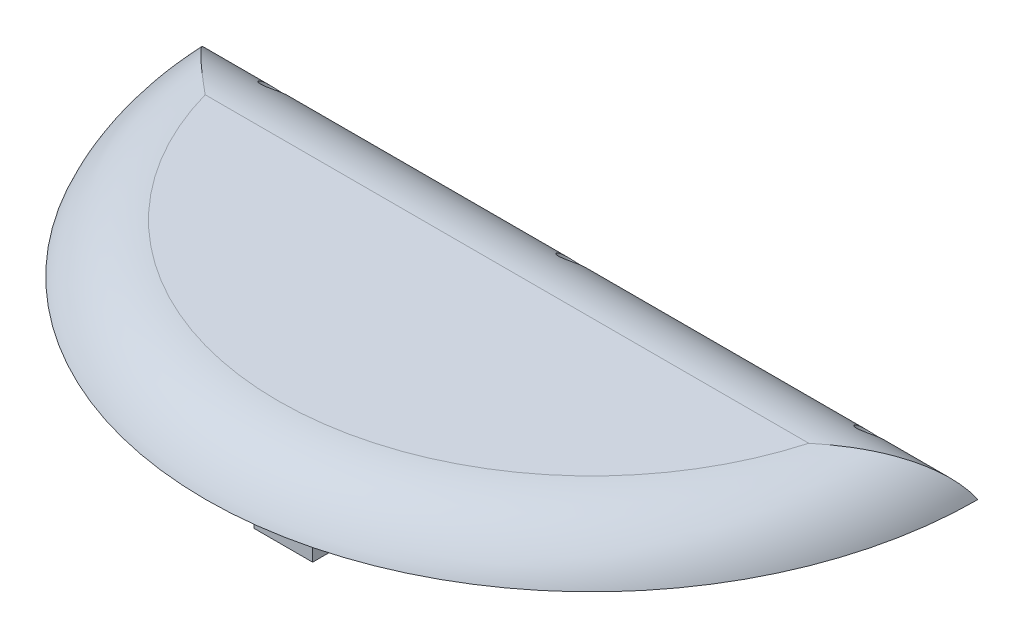
ISO-10303-21;
HEADER;
FILE_DESCRIPTION(('STEP AP214'),'2;1');
FILE_NAME('part.step','',(''),(''),'','','');
FILE_SCHEMA(('AUTOMOTIVE_DESIGN { 1 0 10303 214 1 1 1 1 }'));
ENDSEC;
DATA;
#1=APPLICATION_CONTEXT('core data for automotive mechanical design processes');
#2=APPLICATION_PROTOCOL_DEFINITION('international standard','automotive_design',2000,#1);
#3=PRODUCT_CONTEXT('',#1,'mechanical');
#4=PRODUCT('Part','Part','',(#3));
#5=PRODUCT_RELATED_PRODUCT_CATEGORY('part','',(#4));
#6=PRODUCT_DEFINITION_FORMATION('','',#4);
#7=PRODUCT_DEFINITION_CONTEXT('part definition',#1,'design');
#8=PRODUCT_DEFINITION('design','',#6,#7);
#9=PRODUCT_DEFINITION_SHAPE('','',#8);
#10=(LENGTH_UNIT() NAMED_UNIT(*) SI_UNIT(.MILLI.,.METRE.));
#11=(NAMED_UNIT(*) PLANE_ANGLE_UNIT() SI_UNIT($,.RADIAN.));
#12=(NAMED_UNIT(*) SI_UNIT($,.STERADIAN.) SOLID_ANGLE_UNIT());
#13=UNCERTAINTY_MEASURE_WITH_UNIT(LENGTH_MEASURE(1.E-05),#10,'distance_accuracy_value','');
#14=(GEOMETRIC_REPRESENTATION_CONTEXT(3) GLOBAL_UNCERTAINTY_ASSIGNED_CONTEXT((#13)) GLOBAL_UNIT_ASSIGNED_CONTEXT((#10,
#11,#12)) REPRESENTATION_CONTEXT('',''));
#15=CARTESIAN_POINT('',(0.,0.,0.));
#16=DIRECTION('',(0.,0.,1.));
#17=DIRECTION('',(1.,0.,0.));
#18=AXIS2_PLACEMENT_3D('',#15,#16,#17);
#19=CARTESIAN_POINT('',(0.,58.4278760968653,0.));
#20=DIRECTION('',(0.,1.,0.));
#21=DIRECTION('',(0.,0.,1.));
#22=AXIS2_PLACEMENT_3D('',#19,#20,#21);
#23=PLANE('',#22);
#24=DIRECTION('',(1.,0.,0.));
#25=VECTOR('',#24,1.);
#26=CARTESIAN_POINT('',(-3.,58.4278760968653,31.5));
#27=LINE('',#26,#25);
#28=CARTESIAN_POINT('',(-3.,58.4278760968653,31.5));
#29=VERTEX_POINT('',#28);
#30=CARTESIAN_POINT('',(3.,58.4278760968653,31.5));
#31=VERTEX_POINT('',#30);
#32=EDGE_CURVE('E124',#29,#31,#27,.T.);
#33=ORIENTED_EDGE('',*,*,#32,.T.);
#34=DIRECTION('',(0.,0.,-1.));
#35=VECTOR('',#34,1.);
#36=CARTESIAN_POINT('',(3.,58.4278760968653,28.5));
#37=LINE('',#36,#35);
#38=CARTESIAN_POINT('',(3.,58.4278760968653,28.5));
#39=VERTEX_POINT('',#38);
#40=EDGE_CURVE('E134',#31,#39,#37,.T.);
#41=ORIENTED_EDGE('',*,*,#40,.T.);
#42=DIRECTION('',(-1.,0.,0.));
#43=VECTOR('',#42,1.);
#44=CARTESIAN_POINT('',(-3.,58.4278760968653,28.5));
#45=LINE('',#44,#43);
#46=CARTESIAN_POINT('',(-3.,58.4278760968653,28.5));
#47=VERTEX_POINT('',#46);
#48=EDGE_CURVE('E104',#39,#47,#45,.T.);
#49=ORIENTED_EDGE('',*,*,#48,.T.);
#50=DIRECTION('',(0.,0.,1.));
#51=VECTOR('',#50,1.);
#52=CARTESIAN_POINT('',(-3.,58.4278760968653,28.5));
#53=LINE('',#52,#51);
#54=EDGE_CURVE('E127',#47,#29,#53,.T.);
#55=ORIENTED_EDGE('',*,*,#54,.T.);
#56=EDGE_LOOP('',(#33,#41,#49,#55));
#57=FACE_BOUND('',#56,.T.);
#58=CARTESIAN_POINT('',(0.,58.4278760968653,0.));
#59=DIRECTION('',(0.,1.,0.));
#60=DIRECTION('',(0.,0.,1.));
#61=AXIS2_PLACEMENT_3D('',#58,#59,#60);
#62=CIRCLE('',#61,39.4161984870957);
#63=CARTESIAN_POINT('',(39.4161984870957,58.4278760968653,0.));
#64=VERTEX_POINT('',#63);
#65=CARTESIAN_POINT('',(-39.4161984870957,58.4278760968653,2.77280175019557E-13));
#66=VERTEX_POINT('',#65);
#67=EDGE_CURVE('E160',#64,#66,#62,.F.);
#68=ORIENTED_EDGE('',*,*,#67,.T.);
#69=DIRECTION('',(-1.,0.,0.));
#70=VECTOR('',#69,1.);
#71=CARTESIAN_POINT('',(21.,58.4278760968653,0.));
#72=LINE('',#71,#70);
#73=EDGE_CURVE('E157',#64,#66,#72,.T.);
#74=ORIENTED_EDGE('',*,*,#73,.F.);
#75=EDGE_LOOP('',(#68,#74));
#76=FACE_BOUND('',#75,.T.);
#77=ADVANCED_FACE('F41',(#57,#76),#23,.F.);
#78=CARTESIAN_POINT('',(0.,60.9278760968653,15.));
#79=DIRECTION('',(0.,0.,-1.));
#80=DIRECTION('',(-1.,0.,0.));
#81=AXIS2_PLACEMENT_3D('',#78,#79,#80);
#82=PLANE('',#81);
#83=CARTESIAN_POINT('',(0.,60.9278760968653,15.));
#84=DIRECTION('',(0.,0.,-1.));
#85=DIRECTION('',(-1.,0.,0.));
#86=AXIS2_PLACEMENT_3D('',#83,#84,#85);
#87=CIRCLE('',#86,1.);
#88=CARTESIAN_POINT('',(-1.,60.9278760968653,15.));
#89=VERTEX_POINT('',#88);
#90=EDGE_CURVE('E153',#89,#89,#87,.T.);
#91=ORIENTED_EDGE('',*,*,#90,.T.);
#92=EDGE_LOOP('',(#91));
#93=FACE_BOUND('',#92,.T.);
#94=ADVANCED_FACE('F188',(#93),#82,.T.);
#95=CARTESIAN_POINT('',(-30.4161984870957,60.9278760968653,15.));
#96=DIRECTION('',(0.,0.,-1.));
#97=DIRECTION('',(-1.,0.,0.));
#98=AXIS2_PLACEMENT_3D('',#95,#96,#97);
#99=PLANE('',#98);
#100=CARTESIAN_POINT('',(-30.4161984870957,60.9278760968653,15.));
#101=DIRECTION('',(0.,0.,-1.));
#102=DIRECTION('',(-1.,0.,0.));
#103=AXIS2_PLACEMENT_3D('',#100,#101,#102);
#104=CIRCLE('',#103,0.999999999999998);
#105=CARTESIAN_POINT('',(-31.4161984870957,60.9278760968653,15.));
#106=VERTEX_POINT('',#105);
#107=EDGE_CURVE('E149',#106,#106,#104,.T.);
#108=ORIENTED_EDGE('',*,*,#107,.T.);
#109=EDGE_LOOP('',(#108));
#110=FACE_BOUND('',#109,.T.);
#111=ADVANCED_FACE('F194',(#110),#99,.T.);
#112=CARTESIAN_POINT('',(30.4161984870957,60.9278760968653,15.));
#113=DIRECTION('',(0.,0.,-1.));
#114=DIRECTION('',(-1.,0.,0.));
#115=AXIS2_PLACEMENT_3D('',#112,#113,#114);
#116=PLANE('',#115);
#117=CARTESIAN_POINT('',(30.4161984870957,60.9278760968653,15.));
#118=DIRECTION('',(0.,0.,-1.));
#119=DIRECTION('',(-1.,0.,0.));
#120=AXIS2_PLACEMENT_3D('',#117,#118,#119);
#121=CIRCLE('',#120,1.);
#122=CARTESIAN_POINT('',(29.4161984870957,60.9278760968653,15.));
#123=VERTEX_POINT('',#122);
#124=EDGE_CURVE('E144',#123,#123,#121,.T.);
#125=ORIENTED_EDGE('',*,*,#124,.T.);
#126=EDGE_LOOP('',(#125));
#127=FACE_BOUND('',#126,.T.);
#128=ADVANCED_FACE('F186',(#127),#116,.T.);
#129=CARTESIAN_POINT('',(0.,63.4278760968653,0.));
#130=DIRECTION('',(0.,1.,0.));
#131=DIRECTION('',(0.,0.,1.));
#132=AXIS2_PLACEMENT_3D('',#129,#130,#131);
#133=PLANE('',#132);
#134=CARTESIAN_POINT('',(0.,63.4278760968653,0.));
#135=DIRECTION('',(0.,-1.,0.));
#136=DIRECTION('',(0.,0.,-1.));
#137=AXIS2_PLACEMENT_3D('',#134,#135,#136);
#138=CIRCLE('',#137,32.);
#139=CARTESIAN_POINT('',(30.8058436014987,63.4278760968653,8.66025403784439));
#140=VERTEX_POINT('',#139);
#141=CARTESIAN_POINT('',(-30.8058436014987,63.4278760968653,8.66025403784439));
#142=VERTEX_POINT('',#141);
#143=EDGE_CURVE('E147',#140,#142,#138,.T.);
#144=ORIENTED_EDGE('',*,*,#143,.F.);
#145=DIRECTION('',(1.,0.,0.));
#146=VECTOR('',#145,1.);
#147=CARTESIAN_POINT('',(-32.,63.4278760968653,8.66025403784439));
#148=LINE('',#147,#146);
#149=EDGE_CURVE('E12',#140,#142,#148,.F.);
#150=ORIENTED_EDGE('',*,*,#149,.T.);
#151=EDGE_LOOP('',(#144,#150));
#152=FACE_BOUND('',#151,.T.);
#153=ADVANCED_FACE('F181',(#152),#133,.T.);
#154=CARTESIAN_POINT('',(0.,55.4278760968653,0.));
#155=DIRECTION('',(0.,-1.,0.));
#156=DIRECTION('',(0.,0.,-1.));
#157=AXIS2_PLACEMENT_3D('',#154,#155,#156);
#158=TOROIDAL_SURFACE('',#157,32.,8.);
#159=ORIENTED_EDGE('',*,*,#67,.F.);
#160=CARTESIAN_POINT('',(39.4161984870957,58.4278760968653,0.));
#161=CARTESIAN_POINT('',(39.3248627814146,58.6536788758572,0.130344024552116));
#162=CARTESIAN_POINT('',(39.2241783327426,58.8713148553678,0.267789163419811));
#163=CARTESIAN_POINT('',(39.0065442512372,59.2894743809378,0.554351169310205));
#164=CARTESIAN_POINT('',(38.8896259590301,59.4900297266587,0.703445310177015));
#165=CARTESIAN_POINT('',(38.6429242025145,59.8720485243494,1.00963458995234));
#166=CARTESIAN_POINT('',(38.5132924744738,60.0536939647382,1.16662654360266));
#167=CARTESIAN_POINT('',(38.2419126140847,60.4005824728186,1.48827079105838));
#168=CARTESIAN_POINT('',(38.1001570668415,60.5658153671947,1.65292774429866));
#169=CARTESIAN_POINT('',(37.7590783009663,60.9305417625569,2.04193843014486));
#170=CARTESIAN_POINT('',(37.5558667022851,61.1240411013678,2.26851014704271));
#171=CARTESIAN_POINT('',(37.1344091241299,61.4841461720771,2.72881696461402));
#172=CARTESIAN_POINT('',(36.9161605636529,61.6507472705665,2.96255329120809));
#173=CARTESIAN_POINT('',(36.4659147848451,61.9594027940956,3.43595156131458));
#174=CARTESIAN_POINT('',(36.2338473560937,62.101314387775,3.67563937650925));
#175=CARTESIAN_POINT('',(35.759192007343,62.3609966473796,4.15755686895182));
#176=CARTESIAN_POINT('',(35.5166038080265,62.4787666718914,4.39978661355612));
#177=CARTESIAN_POINT('',(34.9244655735319,62.7340002511076,4.98150829910124));
#178=CARTESIAN_POINT('',(34.5706892176179,62.8607175531027,5.32143192098793));
#179=CARTESIAN_POINT('',(33.849439463058,63.0739382043761,5.99945626360378));
#180=CARTESIAN_POINT('',(33.4819595838633,63.1604222595723,6.33755603303639));
#181=CARTESIAN_POINT('',(32.7370628397682,63.29641462991,7.00834774060771));
#182=CARTESIAN_POINT('',(32.3596703101725,63.3460060709482,7.34105017382659));
#183=CARTESIAN_POINT('',(31.5964719242139,63.4115141994579,7.99965299066279));
#184=CARTESIAN_POINT('',(31.210670740981,63.4274491326234,8.32555696489226));
#185=CARTESIAN_POINT('',(30.8163413047501,63.427873272919,8.65157858610253));
#186=CARTESIAN_POINT('',(30.8110927502553,63.427876094742,8.65591669707391));
#187=CARTESIAN_POINT('',(30.8058436014987,63.4278760968653,8.66025403784438));
#188=B_SPLINE_CURVE_WITH_KNOTS('',3,(#160,#161,#162,#163,#164,#165,#166,#167,#168,#169,#170,
#171,#172,#173,#174,#175,#176,#177,#178,#179,#180,#181,#182,#183,#184,#185,#186,#187),
.UNSPECIFIED.,.F.,.F.,(4,2,2,2,2,2,2,2,2,2,2,2,2,4),(0.,0.828068190173811,1.6545594046316,
2.47216990707783,3.29028408353153,4.37062580112493,5.45115341700784,6.53773793470572,
7.62435131794895,9.14239390817876,10.6611637358248,12.1765010419438,13.6910166500707,
13.7114445406601),.UNSPECIFIED.);
#189=EDGE_CURVE('E55',#64,#140,#188,.T.);
#190=ORIENTED_EDGE('',*,*,#189,.T.);
#191=ORIENTED_EDGE('',*,*,#143,.T.);
#192=CARTESIAN_POINT('',(-39.4161984870957,58.4278760968653,2.77280175019557E-13));
#193=CARTESIAN_POINT('',(-39.3248627814145,58.6536788758573,0.1303440245523));
#194=CARTESIAN_POINT('',(-39.2241783327425,58.8713148553681,0.267789163419996));
#195=CARTESIAN_POINT('',(-39.006544251237,59.2894743809382,0.554351169310471));
#196=CARTESIAN_POINT('',(-38.8896259590298,59.4900297266592,0.703445310177361));
#197=CARTESIAN_POINT('',(-38.6429242025143,59.8720485243499,1.00963458995271));
#198=CARTESIAN_POINT('',(-38.5132924744735,60.0536939647386,1.16662654360297));
#199=CARTESIAN_POINT('',(-38.2419126140845,60.4005824728188,1.48827079105857));
#200=CARTESIAN_POINT('',(-38.1001570668413,60.5658153671948,1.6529277442988));
#201=CARTESIAN_POINT('',(-37.7590783009663,60.9305417625569,2.04193843014487));
#202=CARTESIAN_POINT('',(-37.5558667022851,61.1240411013677,2.26851014704264));
#203=CARTESIAN_POINT('',(-37.1344091241301,61.484146172077,2.7288169646138));
#204=CARTESIAN_POINT('',(-36.9161605636531,61.6507472705663,2.9625532912078));
#205=CARTESIAN_POINT('',(-36.4659147848453,61.9594027940955,3.4359515613143));
#206=CARTESIAN_POINT('',(-36.2338473560938,62.1013143877749,3.67563937650906));
#207=CARTESIAN_POINT('',(-35.759192007343,62.3609966473796,4.15755686895181));
#208=CARTESIAN_POINT('',(-35.5166038080264,62.4787666718914,4.39978661355622));
#209=CARTESIAN_POINT('',(-34.9244655735316,62.7340002511076,4.98150829910138));
#210=CARTESIAN_POINT('',(-34.5706892176174,62.8607175531028,5.32143192098795));
#211=CARTESIAN_POINT('',(-33.8494394630576,63.0739382043763,5.99945626360461));
#212=CARTESIAN_POINT('',(-33.4819595838633,63.1604222595725,6.33755603303817));
#213=CARTESIAN_POINT('',(-32.7370628397664,63.2964146299101,7.00834774060758));
#214=CARTESIAN_POINT('',(-32.3596703101685,63.3460060709483,7.34105017382362));
#215=CARTESIAN_POINT('',(-31.5964719242165,63.4115141994579,7.99965299066698));
#216=CARTESIAN_POINT('',(-31.2106707409923,63.4274491326234,8.32555696490646));
#217=CARTESIAN_POINT('',(-30.8163413047504,63.427873272919,8.65157858610289));
#218=CARTESIAN_POINT('',(-30.8110927502555,63.427876094742,8.65591669707409));
#219=CARTESIAN_POINT('',(-30.8058436014987,63.4278760968653,8.66025403784439));
#220=B_SPLINE_CURVE_WITH_KNOTS('',3,(#192,#193,#194,#195,#196,#197,#198,#199,#200,#201,#202,
#203,#204,#205,#206,#207,#208,#209,#210,#211,#212,#213,#214,#215,#216,#217,#218,#219),
.UNSPECIFIED.,.F.,.F.,(4,2,2,2,2,2,2,2,2,2,2,2,2,4),(0.,0.828068190174115,1.6545594046322,
2.47216990707812,3.29028408353152,4.37062580112456,5.45115341700714,6.53773793470545,
7.62435131794899,9.14239390817916,10.6611637358262,12.1765010419447,13.6910166500705,
13.71144454066),.UNSPECIFIED.);
#221=EDGE_CURVE('E163',#142,#66,#220,.F.);
#222=ORIENTED_EDGE('',*,*,#221,.T.);
#223=EDGE_LOOP('',(#159,#190,#191,#222));
#224=FACE_BOUND('',#223,.T.);
#225=ADVANCED_FACE('F176',(#224),#158,.T.);
#226=CARTESIAN_POINT('',(0.,60.9278760968653,15.));
#227=DIRECTION('',(0.,0.,-1.));
#228=DIRECTION('',(-1.,0.,0.));
#229=AXIS2_PLACEMENT_3D('',#226,#227,#228);
#230=CYLINDRICAL_SURFACE('',#229,1.);
#231=ORIENTED_EDGE('',*,*,#90,.F.);
#232=EDGE_LOOP('',(#231));
#233=FACE_BOUND('',#232,.T.);
#234=CARTESIAN_POINT('',(0.65186975998305,60.1695451559038,1.27446374171467));
#235=CARTESIAN_POINT('',(0.618051878072622,60.1404770228833,1.24793165328114));
#236=CARTESIAN_POINT('',(0.581463062588897,60.1129614834563,1.22313227281306));
#237=CARTESIAN_POINT('',(0.502878914956767,60.0622543445392,1.17786212068647));
#238=CARTESIAN_POINT('',(0.460877505623232,60.0390676782167,1.15739628399894));
#239=CARTESIAN_POINT('',(0.371728498965981,59.9982326096898,1.12160954197757));
#240=CARTESIAN_POINT('',(0.324543286289007,59.9806288566329,1.10633004930512));
#241=CARTESIAN_POINT('',(0.226577317277097,59.9525557568499,1.08206775264967));
#242=CARTESIAN_POINT('',(0.175801151591165,59.9420774766793,1.07307706377611));
#243=CARTESIAN_POINT('',(0.0785408972326485,59.9299040372094,1.06264337295364));
#244=CARTESIAN_POINT('',(0.0322472242379022,59.9273267696662,1.0604421534141));
#245=CARTESIAN_POINT('',(-0.0601792812031219,59.9286204832038,1.06154861097389));
#246=CARTESIAN_POINT('',(-0.106312152537025,59.9324897785511,1.06485484790982));
#247=CARTESIAN_POINT('',(-0.193667439265132,59.9458847506288,1.0763479557246));
#248=CARTESIAN_POINT('',(-0.235005261385864,59.9549867759128,1.08416944228879));
#249=CARTESIAN_POINT('',(-0.315259876949168,59.9779528222321,1.10401661749484));
#250=CARTESIAN_POINT('',(-0.354176484863455,59.9918172076592,1.11604262784688));
#251=CARTESIAN_POINT('',(-0.4313283698312,60.0246445604847,1.14472690487464));
#252=CARTESIAN_POINT('',(-0.469351825327241,60.0438821352586,1.16163711262187));
#253=CARTESIAN_POINT('',(-0.54135393899682,60.0860444988562,1.19904833946562));
#254=CARTESIAN_POINT('',(-0.575330151629434,60.1089714975385,1.21955151130307));
#255=CARTESIAN_POINT('',(-0.65400435431406,60.1690958837251,1.27389750222782));
#256=CARTESIAN_POINT('',(-0.696247809427159,60.2079397490024,1.30948403871817));
#257=CARTESIAN_POINT('',(-0.771702813630424,60.2894601262198,1.38551725520722));
#258=CARTESIAN_POINT('',(-0.804894813384927,60.3321446731175,1.42597418704374));
#259=CARTESIAN_POINT('',(-0.873497660060708,60.435777593044,1.52609605662973));
#260=CARTESIAN_POINT('',(-0.905202121430917,60.4976499681149,1.58733737335749));
#261=CARTESIAN_POINT('',(-0.954551100314343,60.6223590794347,1.71422008017355));
#262=CARTESIAN_POINT('',(-0.972178269114282,60.6851969086443,1.77986679180906));
#263=CARTESIAN_POINT('',(-0.999053631514163,60.8318255396347,1.93740089464096));
#264=CARTESIAN_POINT('',(-1.00323658349312,60.9152818906902,2.03045615007416));
#265=CARTESIAN_POINT('',(-0.992014530306846,61.0782131235713,2.21913984679152));
#266=CARTESIAN_POINT('',(-0.976556699765713,61.1576766679602,2.31477454752468));
#267=CARTESIAN_POINT('',(-0.939383325931953,61.2731742055806,2.45902686295081));
#268=CARTESIAN_POINT('',(-0.924443951300008,61.311411952665,2.50772430846353));
#269=CARTESIAN_POINT('',(-0.889761121567323,61.3861596711457,2.60472261266092));
#270=CARTESIAN_POINT('',(-0.870019761439317,61.422670387723,2.65302363482041));
#271=CARTESIAN_POINT('',(-0.825653975331673,61.4935961148547,2.74859690163941));
#272=CARTESIAN_POINT('',(-0.801048596261386,61.5280186362922,2.79587238520909));
#273=CARTESIAN_POINT('',(-0.74656372416062,61.5945785000554,2.88892532835295));
#274=CARTESIAN_POINT('',(-0.716689595999789,61.626718120672,2.93470425610761));
#275=CARTESIAN_POINT('',(-0.656106529444284,61.6835027209919,3.01696347771346));
#276=CARTESIAN_POINT('',(-0.626238045005066,61.7085388351409,3.05378843874726));
#277=CARTESIAN_POINT('',(-0.561662689576076,61.7562167302755,3.12486130914156));
#278=CARTESIAN_POINT('',(-0.526947822785534,61.7788544434266,3.15910481269703));
#279=CARTESIAN_POINT('',(-0.45151454702052,61.8212061952974,3.22393852553757));
#280=CARTESIAN_POINT('',(-0.410716593047935,61.8408732297934,3.2544687552496));
#281=CARTESIAN_POINT('',(-0.322991733538644,61.875435959523,3.3086410374051));
#282=CARTESIAN_POINT('',(-0.276096295898421,61.8903548820019,3.33231656922078));
#283=CARTESIAN_POINT('',(-0.197714868199588,61.9085805254484,3.36140366381547));
#284=CARTESIAN_POINT('',(-0.168051161814474,61.9141318225382,3.37030823049796));
#285=CARTESIAN_POINT('',(-0.107396293058324,61.9225617403385,3.38385562234544));
#286=CARTESIAN_POINT('',(-0.0764066039087513,61.9254432505651,3.38850305495402));
#287=CARTESIAN_POINT('',(-0.0138089894381272,61.9282731966745,3.39306715932711));
#288=CARTESIAN_POINT('',(0.0178009536119767,61.9282095268375,3.39296430575735));
#289=CARTESIAN_POINT('',(0.0805005230535824,61.9251254113877,3.38799060558752));
#290=CARTESIAN_POINT('',(0.11158987067747,61.9221034301093,3.38311728262715));
#291=CARTESIAN_POINT('',(0.171054530563067,61.913576467642,3.36941769062346));
#292=CARTESIAN_POINT('',(0.199489070864297,61.9081845949263,3.36077160743132));
#293=CARTESIAN_POINT('',(0.254649799690047,61.8953247415686,3.34024835299218));
#294=CARTESIAN_POINT('',(0.281375338441221,61.887855976984,3.32836996171589));
#295=CARTESIAN_POINT('',(0.350704480707004,61.8654800139086,3.29299001848773));
#296=CARTESIAN_POINT('',(0.391581276767136,61.8489905415039,3.26711441983486));
#297=CARTESIAN_POINT('',(0.468191414974298,61.8125276890448,3.21059752407777));
#298=CARTESIAN_POINT('',(0.503906854973786,61.7925426904817,3.17994037194154));
#299=CARTESIAN_POINT('',(0.565561633247346,61.753261276705,3.12048578012703));
#300=CARTESIAN_POINT('',(0.592160648884947,61.7343273533827,3.09212148032529));
#301=CARTESIAN_POINT('',(0.642356074664201,61.6949458791337,3.03381646585828));
#302=CARTESIAN_POINT('',(0.66595041043025,61.674497297755,3.00387468207289));
#303=CARTESIAN_POINT('',(0.732695960417614,61.6111998355792,2.91232450280153));
#304=CARTESIAN_POINT('',(0.771762363240431,61.5664309494402,2.84903965343756));
#305=CARTESIAN_POINT('',(0.831903012638861,61.4845059715757,2.73620709897048));
#306=CARTESIAN_POINT('',(0.855039281379231,61.4481852591538,2.68710846585979));
#307=CARTESIAN_POINT('',(0.896188509392588,61.3735903432607,2.5882305981098));
#308=CARTESIAN_POINT('',(0.914199041936525,61.3353152245755,2.53845105274926));
#309=CARTESIAN_POINT('',(0.960755931422007,61.2178145219008,2.38866005258754));
#310=CARTESIAN_POINT('',(0.981807710577209,61.1359413547197,2.28823470084188));
#311=CARTESIAN_POINT('',(0.99762905720229,61.0089646492068,2.13863758548303));
#312=CARTESIAN_POINT('',(1.00024254803537,60.9656600750932,2.08863564505864));
#313=CARTESIAN_POINT('',(0.999721399690205,60.8780833535254,1.98951166098675));
#314=CARTESIAN_POINT('',(0.996585047184845,60.833810921555,1.94038988401296));
#315=CARTESIAN_POINT('',(0.977886755259317,60.7002886197261,1.79519267316583));
#316=CARTESIAN_POINT('',(0.953086329510742,60.6099788909498,1.70086740523943));
#317=CARTESIAN_POINT('',(0.890584153338471,60.4695505445626,1.5595280569628));
#318=CARTESIAN_POINT('',(0.862571637604236,60.4183728195025,1.50918440790555));
#319=CARTESIAN_POINT('',(0.795494656509535,60.3189803583937,1.41336705166031));
#320=CARTESIAN_POINT('',(0.756481139208809,60.2707531821969,1.36787219657763));
#321=CARTESIAN_POINT('',(0.692744895109765,60.2061921725379,1.30803483768128));
#322=CARTESIAN_POINT('',(0.672840064453057,60.1875701641355,1.29091616100426));
#323=CARTESIAN_POINT('',(0.65186975998305,60.1695451559038,1.27446374171467));
#324=B_SPLINE_CURVE_WITH_KNOTS('',3,(#234,#235,#236,#237,#238,#239,#240,#241,#242,#243,#244,
#245,#246,#247,#248,#249,#250,#251,#252,#253,#254,#255,#256,#257,#258,#259,#260,#261,#262,#263,
#264,#265,#266,#267,#268,#269,#270,#271,#272,#273,#274,#275,#276,#277,#278,#279,#280,#281,#282,
#283,#284,#285,#286,#287,#288,#289,#290,#291,#292,#293,#294,#295,#296,#297,#298,#299,#300,#301,
#302,#303,#304,#305,#306,#307,#308,#309,#310,#311,#312,#313,#314,#315,#316,#317,#318,#319,#320,
#321,#322,#323),.UNSPECIFIED.,.T.,.F.,(4,2,2,2,2,2,2,2,2,2,2,2,2,2,2,2,2,2,2,2,2,2,2,2,2,2,2,2,
2,2,2,2,2,2,2,2,2,2,2,2,2,2,2,2,4),(0.,0.155593881049263,0.311364008182962,0.468350198633096,
0.625139205560386,0.763635373929591,0.902095332152293,1.03066790460549,1.15925031697454,
1.29626004667574,1.43335214882101,1.63480267819108,1.8366849151741,2.11311319135971,
2.38988161151613,2.76316153244375,3.13744754650728,3.32836026645959,3.51918984541719,
3.70928645540677,3.89919060668595,4.05978527892677,4.22064811022543,4.38383677241514,
4.54621440540844,4.64024544390885,4.73417459312164,4.82848985814936,4.92285410839885,
5.01313483819819,5.1034496916883,5.25590350943609,5.40887403533496,5.53843961096793,
5.66809415687137,5.92762512043496,6.12333140779735,6.31913019681042,6.71088034589847,
6.9092555437413,7.10768986264706,7.50292866650585,7.73338983178544,7.96280073233016,
8.05928374294316),.UNSPECIFIED.);
#325=CARTESIAN_POINT('',(0.65186975998305,60.1695451559038,1.27446374171467));
#326=VERTEX_POINT('',#325);
#327=EDGE_CURVE('E46',#326,#326,#324,.T.);
#328=ORIENTED_EDGE('',*,*,#327,.T.);
#329=EDGE_LOOP('',(#328));
#330=FACE_BOUND('',#329,.T.);
#331=ADVANCED_FACE('F180',(#233,#330),#230,.F.);
#332=CARTESIAN_POINT('',(-30.4161984870957,60.9278760968653,15.));
#333=DIRECTION('',(0.,0.,-1.));
#334=DIRECTION('',(-1.,0.,0.));
#335=AXIS2_PLACEMENT_3D('',#332,#333,#334);
#336=CYLINDRICAL_SURFACE('',#335,0.999999999999998);
#337=ORIENTED_EDGE('',*,*,#107,.F.);
#338=EDGE_LOOP('',(#337));
#339=FACE_BOUND('',#338,.T.);
#340=CARTESIAN_POINT('',(-29.7643287271126,60.1695451559038,1.27446374171467));
#341=CARTESIAN_POINT('',(-29.798146609023,60.1404770228833,1.24793165328114));
#342=CARTESIAN_POINT('',(-29.8347354245068,60.1129614834563,1.22313227281306));
#343=CARTESIAN_POINT('',(-29.9133195721389,60.0622543445392,1.17786212068647));
#344=CARTESIAN_POINT('',(-29.9553209814724,60.0390676782167,1.15739628399895));
#345=CARTESIAN_POINT('',(-30.0444699881297,59.9982326096898,1.12160954197757));
#346=CARTESIAN_POINT('',(-30.0916552008067,59.9806288566329,1.10633004930512));
#347=CARTESIAN_POINT('',(-30.1896211698186,59.9525557568499,1.08206775264967));
#348=CARTESIAN_POINT('',(-30.2403973355045,59.9420774766793,1.07307706377611));
#349=CARTESIAN_POINT('',(-30.337657589863,59.9299040372094,1.06264337295365));
#350=CARTESIAN_POINT('',(-30.3839512628578,59.9273267696662,1.0604421534141));
#351=CARTESIAN_POINT('',(-30.4763777682988,59.9286204832038,1.06154861097389));
#352=CARTESIAN_POINT('',(-30.5225106396327,59.9324897785511,1.06485484790982));
#353=CARTESIAN_POINT('',(-30.6098659263608,59.9458847506288,1.0763479557246));
#354=CARTESIAN_POINT('',(-30.6512037484815,59.9549867759128,1.08416944228879));
#355=CARTESIAN_POINT('',(-30.7314583640448,59.9779528222321,1.10401661749484));
#356=CARTESIAN_POINT('',(-30.7703749719591,59.9918172076592,1.11604262784688));
#357=CARTESIAN_POINT('',(-30.8475268569269,60.0246445604847,1.14472690487463));
#358=CARTESIAN_POINT('',(-30.8855503124229,60.0438821352586,1.16163711262186));
#359=CARTESIAN_POINT('',(-30.9575524260925,60.0860444988562,1.19904833946562));
#360=CARTESIAN_POINT('',(-30.9915286387251,60.1089714975385,1.21955151130306));
#361=CARTESIAN_POINT('',(-31.0702028414097,60.1690958837251,1.27389750222782));
#362=CARTESIAN_POINT('',(-31.1124462965228,60.2079397490024,1.30948403871817));
#363=CARTESIAN_POINT('',(-31.1879013007261,60.2894601262198,1.38551725520721));
#364=CARTESIAN_POINT('',(-31.2210933004806,60.3321446731175,1.42597418704373));
#365=CARTESIAN_POINT('',(-31.2896961471564,60.435777593044,1.52609605662972));
#366=CARTESIAN_POINT('',(-31.3214006085266,60.4976499681148,1.58733737335748));
#367=CARTESIAN_POINT('',(-31.37074958741,60.6223590794347,1.71422008017353));
#368=CARTESIAN_POINT('',(-31.3883767562099,60.6851969086443,1.77986679180904));
#369=CARTESIAN_POINT('',(-31.4152521186098,60.8318255396347,1.93740089464094));
#370=CARTESIAN_POINT('',(-31.4194350705888,60.9152818906901,2.03045615007414));
#371=CARTESIAN_POINT('',(-31.4082130174025,61.0782131235713,2.2191398467915));
#372=CARTESIAN_POINT('',(-31.3927551868614,61.1576766679602,2.31477454752465));
#373=CARTESIAN_POINT('',(-31.3555818130276,61.2731742055806,2.45902686295077));
#374=CARTESIAN_POINT('',(-31.3406424383957,61.311411952665,2.50772430846349));
#375=CARTESIAN_POINT('',(-31.305959608663,61.3861596711457,2.60472261266088));
#376=CARTESIAN_POINT('',(-31.286218248535,61.422670387723,2.65302363482037));
#377=CARTESIAN_POINT('',(-31.2418524624274,61.4935961148546,2.74859690163937));
#378=CARTESIAN_POINT('',(-31.2172470833571,61.5280186362922,2.79587238520905));
#379=CARTESIAN_POINT('',(-31.1627622112563,61.5945785000553,2.88892532835292));
#380=CARTESIAN_POINT('',(-31.1328880830955,61.626718120672,2.93470425610758));
#381=CARTESIAN_POINT('',(-31.07230501654,61.6835027209919,3.01696347771343));
#382=CARTESIAN_POINT('',(-31.0424365321008,61.7085388351409,3.05378843874723));
#383=CARTESIAN_POINT('',(-30.9778611766718,61.7562167302754,3.12486130914155));
#384=CARTESIAN_POINT('',(-30.9431463098812,61.7788544434266,3.15910481269702));
#385=CARTESIAN_POINT('',(-30.8677130341162,61.8212061952973,3.22393852553756));
#386=CARTESIAN_POINT('',(-30.8269150801436,61.8408732297934,3.2544687552496));
#387=CARTESIAN_POINT('',(-30.7391902206343,61.875435959523,3.3086410374051));
#388=CARTESIAN_POINT('',(-30.6922947829941,61.8903548820019,3.33231656922078));
#389=CARTESIAN_POINT('',(-30.6139133552952,61.9085805254484,3.36140366381547));
#390=CARTESIAN_POINT('',(-30.5842496489101,61.9141318225382,3.37030823049795));
#391=CARTESIAN_POINT('',(-30.523594780154,61.9225617403385,3.38385562234543));
#392=CARTESIAN_POINT('',(-30.4926050910044,61.9254432505651,3.38850305495401));
#393=CARTESIAN_POINT('',(-30.4300074765338,61.9282731966745,3.39306715932711));
#394=CARTESIAN_POINT('',(-30.3983975334837,61.9282095268375,3.39296430575734));
#395=CARTESIAN_POINT('',(-30.3356979640421,61.9251254113877,3.38799060558752));
#396=CARTESIAN_POINT('',(-30.3046086164182,61.9221034301093,3.38311728262715));
#397=CARTESIAN_POINT('',(-30.2451439565326,61.913576467642,3.36941769062346));
#398=CARTESIAN_POINT('',(-30.2167094162314,61.9081845949263,3.36077160743131));
#399=CARTESIAN_POINT('',(-30.1615486874056,61.8953247415686,3.34024835299217));
#400=CARTESIAN_POINT('',(-30.1348231486544,61.887855976984,3.32836996171589));
#401=CARTESIAN_POINT('',(-30.0654940063887,61.8654800139086,3.29299001848772));
#402=CARTESIAN_POINT('',(-30.0246172103285,61.8489905415039,3.26711441983486));
#403=CARTESIAN_POINT('',(-29.9480070721214,61.8125276890448,3.21059752407776));
#404=CARTESIAN_POINT('',(-29.9122916321219,61.7925426904817,3.17994037194154));
#405=CARTESIAN_POINT('',(-29.8506368538483,61.753261276705,3.12048578012703));
#406=CARTESIAN_POINT('',(-29.8240378382107,61.7343273533827,3.09212148032529));
#407=CARTESIAN_POINT('',(-29.7738424124315,61.6949458791337,3.03381646585827));
#408=CARTESIAN_POINT('',(-29.7502480766654,61.674497297755,3.00387468207288));
#409=CARTESIAN_POINT('',(-29.683502526678,61.6111998355792,2.91232450280152));
#410=CARTESIAN_POINT('',(-29.6444361238552,61.5664309494402,2.84903965343755));
#411=CARTESIAN_POINT('',(-29.5842954744568,61.4845059715757,2.73620709897048));
#412=CARTESIAN_POINT('',(-29.5611592057164,61.4481852591538,2.68710846585978));
#413=CARTESIAN_POINT('',(-29.5200099777031,61.3735903432607,2.58823059810979));
#414=CARTESIAN_POINT('',(-29.5019994451591,61.3353152245755,2.53845105274925));
#415=CARTESIAN_POINT('',(-29.4554425556737,61.2178145219008,2.38866005258753));
#416=CARTESIAN_POINT('',(-29.4343907765185,61.1359413547197,2.28823470084187));
#417=CARTESIAN_POINT('',(-29.4185694298934,61.0089646492068,2.13863758548302));
#418=CARTESIAN_POINT('',(-29.4159559390603,60.9656600750932,2.08863564505863));
#419=CARTESIAN_POINT('',(-29.4164770874055,60.8780833535254,1.98951166098675));
#420=CARTESIAN_POINT('',(-29.4196134399108,60.833810921555,1.94038988401295));
#421=CARTESIAN_POINT('',(-29.4383117318364,60.7002886197261,1.79519267316582));
#422=CARTESIAN_POINT('',(-29.4631121575849,60.6099788909498,1.70086740523942));
#423=CARTESIAN_POINT('',(-29.5256143337572,60.4695505445626,1.55952805696279));
#424=CARTESIAN_POINT('',(-29.5536268494914,60.4183728195025,1.50918440790554));
#425=CARTESIAN_POINT('',(-29.6207038305861,60.3189803583936,1.41336705166031));
#426=CARTESIAN_POINT('',(-29.6597173478869,60.2707531821969,1.36787219657763));
#427=CARTESIAN_POINT('',(-29.7234535919859,60.2061921725379,1.30803483768128));
#428=CARTESIAN_POINT('',(-29.7433584226426,60.1875701641355,1.29091616100426));
#429=CARTESIAN_POINT('',(-29.7643287271126,60.1695451559038,1.27446374171467));
#430=B_SPLINE_CURVE_WITH_KNOTS('',3,(#340,#341,#342,#343,#344,#345,#346,#347,#348,#349,#350,
#351,#352,#353,#354,#355,#356,#357,#358,#359,#360,#361,#362,#363,#364,#365,#366,#367,#368,#369,
#370,#371,#372,#373,#374,#375,#376,#377,#378,#379,#380,#381,#382,#383,#384,#385,#386,#387,#388,
#389,#390,#391,#392,#393,#394,#395,#396,#397,#398,#399,#400,#401,#402,#403,#404,#405,#406,#407,
#408,#409,#410,#411,#412,#413,#414,#415,#416,#417,#418,#419,#420,#421,#422,#423,#424,#425,#426,
#427,#428,#429),.UNSPECIFIED.,.T.,.F.,(4,2,2,2,2,2,2,2,2,2,2,2,2,2,2,2,2,2,2,2,2,2,2,2,2,2,2,2,
2,2,2,2,2,2,2,2,2,2,2,2,2,2,2,2,4),(0.,0.155593881049258,0.311364008182953,0.468350198633084,
0.625139205560372,0.76363537392958,0.902095332152283,1.03066790460547,1.15925031697453,
1.29626004667573,1.43335214882099,1.63480267819106,1.83668491517408,2.11311319135968,
2.3898816115161,2.76316153244371,3.13744754650723,3.32836026645955,3.51918984541714,
3.70928645540672,3.89919060668591,4.05978527892673,4.2206481102254,4.38383677241512,
4.54621440540844,4.64024544390885,4.73417459312164,4.82848985814936,4.92285410839885,
5.01313483819818,5.10344969168829,5.25590350943608,5.40887403533495,5.53843961096793,
5.66809415687137,5.92762512043496,6.12333140779734,6.31913019681041,6.71088034589846,
6.90925554374129,7.10768986264705,7.50292866650585,7.73338983178544,7.96280073233015,
8.05928374294314),.UNSPECIFIED.);
#431=CARTESIAN_POINT('',(-29.7643287271126,60.1695451559038,1.27446374171467));
#432=VERTEX_POINT('',#431);
#433=EDGE_CURVE('E152',#432,#432,#430,.T.);
#434=ORIENTED_EDGE('',*,*,#433,.T.);
#435=EDGE_LOOP('',(#434));
#436=FACE_BOUND('',#435,.T.);
#437=ADVANCED_FACE('F198',(#339,#436),#336,.F.);
#438=CARTESIAN_POINT('',(30.4161984870957,60.9278760968653,15.));
#439=DIRECTION('',(0.,0.,-1.));
#440=DIRECTION('',(-1.,0.,0.));
#441=AXIS2_PLACEMENT_3D('',#438,#439,#440);
#442=CYLINDRICAL_SURFACE('',#441,1.);
#443=ORIENTED_EDGE('',*,*,#124,.F.);
#444=EDGE_LOOP('',(#443));
#445=FACE_BOUND('',#444,.T.);
#446=CARTESIAN_POINT('',(31.0680682470787,60.1695451559038,1.27446374171467));
#447=CARTESIAN_POINT('',(31.0342503651683,60.1404770228833,1.24793165328114));
#448=CARTESIAN_POINT('',(30.9976615496846,60.1129614834563,1.22313227281306));
#449=CARTESIAN_POINT('',(30.9190774020524,60.0622543445392,1.17786212068647));
#450=CARTESIAN_POINT('',(30.8770759927189,60.0390676782167,1.15739628399894));
#451=CARTESIAN_POINT('',(30.7879269860617,59.9982326096898,1.12160954197757));
#452=CARTESIAN_POINT('',(30.7407417733847,59.9806288566329,1.10633004930512));
#453=CARTESIAN_POINT('',(30.6427758043728,59.9525557568499,1.08206775264966));
#454=CARTESIAN_POINT('',(30.5919996386868,59.9420774766793,1.0730770637761));
#455=CARTESIAN_POINT('',(30.4947393843283,59.9299040372094,1.06264337295364));
#456=CARTESIAN_POINT('',(30.4484457113336,59.9273267696662,1.0604421534141));
#457=CARTESIAN_POINT('',(30.3560192058926,59.9286204832038,1.06154861097389));
#458=CARTESIAN_POINT('',(30.3098863345586,59.9324897785511,1.06485484790982));
#459=CARTESIAN_POINT('',(30.2225310478305,59.9458847506288,1.0763479557246));
#460=CARTESIAN_POINT('',(30.1811932257098,59.9549867759128,1.08416944228878));
#461=CARTESIAN_POINT('',(30.1009386101465,59.9779528222321,1.10401661749484));
#462=CARTESIAN_POINT('',(30.0620220022322,59.9918172076592,1.11604262784688));
#463=CARTESIAN_POINT('',(29.9848701172645,60.0246445604847,1.14472690487463));
#464=CARTESIAN_POINT('',(29.9468466617684,60.0438821352586,1.16163711262186));
#465=CARTESIAN_POINT('',(29.8748445480989,60.0860444988562,1.19904833946561));
#466=CARTESIAN_POINT('',(29.8408683354662,60.1089714975385,1.21955151130306));
#467=CARTESIAN_POINT('',(29.7621941327816,60.1690958837251,1.27389750222781));
#468=CARTESIAN_POINT('',(29.7199506776685,60.2079397490024,1.30948403871817));
#469=CARTESIAN_POINT('',(29.6444956734652,60.2894601262198,1.38551725520722));
#470=CARTESIAN_POINT('',(29.6113036737107,60.3321446731175,1.42597418704373));
#471=CARTESIAN_POINT('',(29.542700827035,60.435777593044,1.52609605662972));
#472=CARTESIAN_POINT('',(29.5109963656648,60.4976499681149,1.58733737335748));
#473=CARTESIAN_POINT('',(29.4616473867813,60.6223590794347,1.71422008017354));
#474=CARTESIAN_POINT('',(29.4440202179814,60.6851969086443,1.77986679180905));
#475=CARTESIAN_POINT('',(29.4171448555815,60.8318255396347,1.93740089464095));
#476=CARTESIAN_POINT('',(29.4129619036026,60.9152818906902,2.03045615007415));
#477=CARTESIAN_POINT('',(29.4241839567888,61.0782131235713,2.21913984679151));
#478=CARTESIAN_POINT('',(29.43964178733,61.1576766679602,2.31477454752467));
#479=CARTESIAN_POINT('',(29.4768151611637,61.2731742055806,2.45902686295079));
#480=CARTESIAN_POINT('',(29.4917545357957,61.311411952665,2.50772430846351));
#481=CARTESIAN_POINT('',(29.5264373655283,61.3861596711457,2.6047226126609));
#482=CARTESIAN_POINT('',(29.5461787256563,61.422670387723,2.65302363482038));
#483=CARTESIAN_POINT('',(29.590544511764,61.4935961148547,2.74859690163938));
#484=CARTESIAN_POINT('',(29.6151498908343,61.5280186362922,2.79587238520907));
#485=CARTESIAN_POINT('',(29.669634762935,61.5945785000553,2.88892532835293));
#486=CARTESIAN_POINT('',(29.6995088910959,61.626718120672,2.9347042561076));
#487=CARTESIAN_POINT('',(29.7600919576514,61.6835027209919,3.01696347771345));
#488=CARTESIAN_POINT('',(29.7899604420906,61.7085388351409,3.05378843874725));
#489=CARTESIAN_POINT('',(29.8545357975196,61.7562167302755,3.12486130914156));
#490=CARTESIAN_POINT('',(29.8892506643101,61.7788544434266,3.15910481269703));
#491=CARTESIAN_POINT('',(29.9646839400751,61.8212061952974,3.22393852553756));
#492=CARTESIAN_POINT('',(30.0054818940477,61.8408732297934,3.2544687552496));
#493=CARTESIAN_POINT('',(30.093206753557,61.875435959523,3.3086410374051));
#494=CARTESIAN_POINT('',(30.1401021911972,61.8903548820019,3.33231656922078));
#495=CARTESIAN_POINT('',(30.2184836188961,61.9085805254484,3.36140366381547));
#496=CARTESIAN_POINT('',(30.2481473252812,61.9141318225382,3.37030823049796));
#497=CARTESIAN_POINT('',(30.3088021940373,61.9225617403385,3.38385562234544));
#498=CARTESIAN_POINT('',(30.3397918831869,61.9254432505651,3.38850305495402));
#499=CARTESIAN_POINT('',(30.4023894976575,61.9282731966745,3.39306715932711));
#500=CARTESIAN_POINT('',(30.4339994407076,61.9282095268375,3.39296430575735));
#501=CARTESIAN_POINT('',(30.4966990101492,61.9251254113877,3.38799060558753));
#502=CARTESIAN_POINT('',(30.5277883577731,61.9221034301093,3.38311728262716));
#503=CARTESIAN_POINT('',(30.5872530176587,61.913576467642,3.36941769062346));
#504=CARTESIAN_POINT('',(30.61568755796,61.9081845949263,3.36077160743133));
#505=CARTESIAN_POINT('',(30.6708482867857,61.8953247415686,3.34024835299218));
#506=CARTESIAN_POINT('',(30.6975738255369,61.887855976984,3.3283699617159));
#507=CARTESIAN_POINT('',(30.7669029678027,61.8654800139086,3.29299001848773));
#508=CARTESIAN_POINT('',(30.8077797638628,61.8489905415039,3.26711441983487));
#509=CARTESIAN_POINT('',(30.88438990207,61.8125276890448,3.21059752407778));
#510=CARTESIAN_POINT('',(30.9201053420694,61.7925426904817,3.17994037194155));
#511=CARTESIAN_POINT('',(30.981760120343,61.753261276705,3.12048578012705));
#512=CARTESIAN_POINT('',(31.0083591359806,61.7343273533827,3.09212148032531));
#513=CARTESIAN_POINT('',(31.0585545617599,61.6949458791337,3.03381646585829));
#514=CARTESIAN_POINT('',(31.0821488975259,61.674497297755,3.00387468207291));
#515=CARTESIAN_POINT('',(31.1488944475133,61.6111998355792,2.91232450280155));
#516=CARTESIAN_POINT('',(31.1879608503361,61.5664309494402,2.84903965343758));
#517=CARTESIAN_POINT('',(31.2481014997345,61.4845059715757,2.7362070989705));
#518=CARTESIAN_POINT('',(31.2712377684749,61.4481852591538,2.68710846585981));
#519=CARTESIAN_POINT('',(31.3123869964883,61.3735903432607,2.58823059810982));
#520=CARTESIAN_POINT('',(31.3303975290322,61.3353152245755,2.53845105274928));
#521=CARTESIAN_POINT('',(31.3769544185177,61.2178145219008,2.38866005258755));
#522=CARTESIAN_POINT('',(31.3980061976729,61.1359413547197,2.2882347008419));
#523=CARTESIAN_POINT('',(31.413827544298,61.0089646492068,2.13863758548304));
#524=CARTESIAN_POINT('',(31.416441035131,60.9656600750932,2.08863564505865));
#525=CARTESIAN_POINT('',(31.4159198867859,60.8780833535254,1.98951166098677));
#526=CARTESIAN_POINT('',(31.4127835342805,60.833810921555,1.94038988401297));
#527=CARTESIAN_POINT('',(31.394085242355,60.7002886197262,1.79519267316584));
#528=CARTESIAN_POINT('',(31.3692848166064,60.6099788909498,1.70086740523944));
#529=CARTESIAN_POINT('',(31.3067826404341,60.4695505445626,1.55952805696281));
#530=CARTESIAN_POINT('',(31.2787701246999,60.4183728195025,1.50918440790556));
#531=CARTESIAN_POINT('',(31.2116931436052,60.3189803583937,1.41336705166032));
#532=CARTESIAN_POINT('',(31.1726796263045,60.2707531821969,1.36787219657764));
#533=CARTESIAN_POINT('',(31.1089433822054,60.2061921725379,1.30803483768129));
#534=CARTESIAN_POINT('',(31.0890385515487,60.1875701641355,1.29091616100426));
#535=CARTESIAN_POINT('',(31.0680682470787,60.1695451559038,1.27446374171467));
#536=B_SPLINE_CURVE_WITH_KNOTS('',3,(#446,#447,#448,#449,#450,#451,#452,#453,#454,#455,#456,
#457,#458,#459,#460,#461,#462,#463,#464,#465,#466,#467,#468,#469,#470,#471,#472,#473,#474,#475,
#476,#477,#478,#479,#480,#481,#482,#483,#484,#485,#486,#487,#488,#489,#490,#491,#492,#493,#494,
#495,#496,#497,#498,#499,#500,#501,#502,#503,#504,#505,#506,#507,#508,#509,#510,#511,#512,#513,
#514,#515,#516,#517,#518,#519,#520,#521,#522,#523,#524,#525,#526,#527,#528,#529,#530,#531,#532,
#533,#534,#535),.UNSPECIFIED.,.T.,.F.,(4,2,2,2,2,2,2,2,2,2,2,2,2,2,2,2,2,2,2,2,2,2,2,2,2,2,2,2,
2,2,2,2,2,2,2,2,2,2,2,2,2,2,2,2,4),(0.,0.155593881049262,0.311364008182958,0.46835019863309,
0.625139205560383,0.763635373929587,0.902095332152289,1.03066790460548,1.15925031697454,
1.29626004667574,1.433352148821,1.63480267819107,1.83668491517409,2.1131131913597,
2.38988161151612,2.76316153244374,3.13744754650726,3.32836026645957,3.51918984541717,
3.70928645540674,3.89919060668594,4.05978527892676,4.22064811022542,4.38383677241514,
4.54621440540845,4.64024544390885,4.73417459312164,4.82848985814936,4.92285410839885,
5.01313483819818,5.10344969168829,5.25590350943607,5.40887403533495,5.53843961096792,
5.66809415687135,5.92762512043494,6.12333140779734,6.3191301968104,6.71088034589845,
6.90925554374129,7.10768986264704,7.50292866650584,7.73338983178544,7.96280073233015,
8.05928374294317),.UNSPECIFIED.);
#537=CARTESIAN_POINT('',(31.0680682470787,60.1695451559038,1.27446374171467));
#538=VERTEX_POINT('',#537);
#539=EDGE_CURVE('E148',#538,#538,#536,.T.);
#540=ORIENTED_EDGE('',*,*,#539,.T.);
#541=EDGE_LOOP('',(#540));
#542=FACE_BOUND('',#541,.T.);
#543=ADVANCED_FACE('F190',(#445,#542),#442,.F.);
#544=CARTESIAN_POINT('',(3.,50.4278760968653,28.5));
#545=DIRECTION('',(1.,0.,0.));
#546=DIRECTION('',(0.,0.,-1.));
#547=AXIS2_PLACEMENT_3D('',#544,#545,#546);
#548=PLANE('',#547);
#549=CARTESIAN_POINT('',(3.,54.4278760968653,30.));
#550=DIRECTION('',(1.,0.,0.));
#551=DIRECTION('',(0.,0.,-1.));
#552=AXIS2_PLACEMENT_3D('',#549,#550,#551);
#553=CIRCLE('',#552,1.);
#554=CARTESIAN_POINT('',(3.,54.4278760968653,29.));
#555=VERTEX_POINT('',#554);
#556=EDGE_CURVE('E130',#555,#555,#553,.T.);
#557=ORIENTED_EDGE('',*,*,#556,.F.);
#558=EDGE_LOOP('',(#557));
#559=FACE_BOUND('',#558,.T.);
#560=ORIENTED_EDGE('',*,*,#40,.F.);
#561=DIRECTION('',(0.,1.,0.));
#562=VECTOR('',#561,1.);
#563=CARTESIAN_POINT('',(3.,50.4278760968653,31.5));
#564=LINE('',#563,#562);
#565=CARTESIAN_POINT('',(3.,50.4278760968653,31.5));
#566=VERTEX_POINT('',#565);
#567=EDGE_CURVE('E123',#566,#31,#564,.T.);
#568=ORIENTED_EDGE('',*,*,#567,.F.);
#569=DIRECTION('',(0.,0.,-1.));
#570=VECTOR('',#569,1.);
#571=CARTESIAN_POINT('',(3.,50.4278760968653,28.5));
#572=LINE('',#571,#570);
#573=CARTESIAN_POINT('',(3.,50.4278760968653,28.5));
#574=VERTEX_POINT('',#573);
#575=EDGE_CURVE('E117',#566,#574,#572,.T.);
#576=ORIENTED_EDGE('',*,*,#575,.T.);
#577=DIRECTION('',(0.,1.,0.));
#578=VECTOR('',#577,1.);
#579=CARTESIAN_POINT('',(3.,50.4278760968653,28.5));
#580=LINE('',#579,#578);
#581=EDGE_CURVE('E98',#574,#39,#580,.T.);
#582=ORIENTED_EDGE('',*,*,#581,.T.);
#583=EDGE_LOOP('',(#560,#568,#576,#582));
#584=FACE_BOUND('',#583,.T.);
#585=ADVANCED_FACE('F122',(#559,#584),#548,.T.);
#586=CARTESIAN_POINT('',(-3.,50.4278760968653,31.5));
#587=DIRECTION('',(0.,0.,1.));
#588=DIRECTION('',(1.,0.,0.));
#589=AXIS2_PLACEMENT_3D('',#586,#587,#588);
#590=PLANE('',#589);
#591=ORIENTED_EDGE('',*,*,#32,.F.);
#592=DIRECTION('',(0.,1.,0.));
#593=VECTOR('',#592,1.);
#594=CARTESIAN_POINT('',(-3.,50.4278760968653,31.5));
#595=LINE('',#594,#593);
#596=CARTESIAN_POINT('',(-3.,50.4278760968653,31.5));
#597=VERTEX_POINT('',#596);
#598=EDGE_CURVE('E141',#597,#29,#595,.T.);
#599=ORIENTED_EDGE('',*,*,#598,.F.);
#600=DIRECTION('',(1.,0.,0.));
#601=VECTOR('',#600,1.);
#602=CARTESIAN_POINT('',(-3.,50.4278760968653,31.5));
#603=LINE('',#602,#601);
#604=EDGE_CURVE('E110',#597,#566,#603,.T.);
#605=ORIENTED_EDGE('',*,*,#604,.T.);
#606=ORIENTED_EDGE('',*,*,#567,.T.);
#607=EDGE_LOOP('',(#591,#599,#605,#606));
#608=FACE_BOUND('',#607,.T.);
#609=ADVANCED_FACE('F205',(#608),#590,.T.);
#610=CARTESIAN_POINT('',(-3.,50.4278760968653,28.5));
#611=DIRECTION('',(-1.,0.,0.));
#612=DIRECTION('',(0.,0.,1.));
#613=AXIS2_PLACEMENT_3D('',#610,#611,#612);
#614=PLANE('',#613);
#615=CARTESIAN_POINT('',(-3.,54.4278760968653,30.));
#616=DIRECTION('',(-1.,0.,0.));
#617=DIRECTION('',(0.,0.,1.));
#618=AXIS2_PLACEMENT_3D('',#615,#616,#617);
#619=CIRCLE('',#618,1.);
#620=CARTESIAN_POINT('',(-3.,54.4278760968653,31.));
#621=VERTEX_POINT('',#620);
#622=EDGE_CURVE('E136',#621,#621,#619,.T.);
#623=ORIENTED_EDGE('',*,*,#622,.F.);
#624=EDGE_LOOP('',(#623));
#625=FACE_BOUND('',#624,.T.);
#626=ORIENTED_EDGE('',*,*,#54,.F.);
#627=DIRECTION('',(0.,1.,0.));
#628=VECTOR('',#627,1.);
#629=CARTESIAN_POINT('',(-3.,50.4278760968653,28.5));
#630=LINE('',#629,#628);
#631=CARTESIAN_POINT('',(-3.,50.4278760968653,28.5));
#632=VERTEX_POINT('',#631);
#633=EDGE_CURVE('E109',#632,#47,#630,.T.);
#634=ORIENTED_EDGE('',*,*,#633,.F.);
#635=DIRECTION('',(0.,0.,1.));
#636=VECTOR('',#635,1.);
#637=CARTESIAN_POINT('',(-3.,50.4278760968653,28.5));
#638=LINE('',#637,#636);
#639=EDGE_CURVE('E120',#632,#597,#638,.T.);
#640=ORIENTED_EDGE('',*,*,#639,.T.);
#641=ORIENTED_EDGE('',*,*,#598,.T.);
#642=EDGE_LOOP('',(#626,#634,#640,#641));
#643=FACE_BOUND('',#642,.T.);
#644=ADVANCED_FACE('F280',(#625,#643),#614,.T.);
#645=CARTESIAN_POINT('',(-3.,50.4278760968653,28.5));
#646=DIRECTION('',(0.,0.,-1.));
#647=DIRECTION('',(-1.,0.,0.));
#648=AXIS2_PLACEMENT_3D('',#645,#646,#647);
#649=PLANE('',#648);
#650=ORIENTED_EDGE('',*,*,#48,.F.);
#651=ORIENTED_EDGE('',*,*,#581,.F.);
#652=DIRECTION('',(-1.,0.,0.));
#653=VECTOR('',#652,1.);
#654=CARTESIAN_POINT('',(-3.,50.4278760968653,28.5));
#655=LINE('',#654,#653);
#656=EDGE_CURVE('E102',#574,#632,#655,.T.);
#657=ORIENTED_EDGE('',*,*,#656,.T.);
#658=ORIENTED_EDGE('',*,*,#633,.T.);
#659=EDGE_LOOP('',(#650,#651,#657,#658));
#660=FACE_BOUND('',#659,.T.);
#661=ADVANCED_FACE('F100',(#660),#649,.T.);
#662=CARTESIAN_POINT('',(0.,50.4278760968653,0.));
#663=DIRECTION('',(0.,1.,0.));
#664=DIRECTION('',(0.,0.,1.));
#665=AXIS2_PLACEMENT_3D('',#662,#663,#664);
#666=PLANE('',#665);
#667=ORIENTED_EDGE('',*,*,#575,.F.);
#668=ORIENTED_EDGE('',*,*,#604,.F.);
#669=ORIENTED_EDGE('',*,*,#639,.F.);
#670=ORIENTED_EDGE('',*,*,#656,.F.);
#671=EDGE_LOOP('',(#667,#668,#669,#670));
#672=FACE_BOUND('',#671,.T.);
#673=ADVANCED_FACE('F115',(#672),#666,.F.);
#674=CARTESIAN_POINT('',(-4.5,54.4278760968653,30.));
#675=DIRECTION('',(1.,0.,0.));
#676=DIRECTION('',(0.,0.,-1.));
#677=AXIS2_PLACEMENT_3D('',#674,#675,#676);
#678=CYLINDRICAL_SURFACE('',#677,1.);
#679=ORIENTED_EDGE('',*,*,#622,.T.);
#680=EDGE_LOOP('',(#679));
#681=FACE_BOUND('',#680,.T.);
#682=ORIENTED_EDGE('',*,*,#556,.T.);
#683=EDGE_LOOP('',(#682));
#684=FACE_BOUND('',#683,.T.);
#685=ADVANCED_FACE('F230',(#681,#684),#678,.F.);
#686=CARTESIAN_POINT('',(21.,53.4278760968653,8.66025403784438));
#687=DIRECTION('',(-1.,0.,0.));
#688=DIRECTION('',(0.,0.,1.));
#689=AXIS2_PLACEMENT_3D('',#686,#687,#688);
#690=CYLINDRICAL_SURFACE('',#689,10.);
#691=ORIENTED_EDGE('',*,*,#221,.F.);
#692=ORIENTED_EDGE('',*,*,#149,.F.);
#693=ORIENTED_EDGE('',*,*,#189,.F.);
#694=ORIENTED_EDGE('',*,*,#73,.T.);
#695=EDGE_LOOP('',(#691,#692,#693,#694));
#696=FACE_BOUND('',#695,.T.);
#697=ORIENTED_EDGE('',*,*,#539,.F.);
#698=EDGE_LOOP('',(#697));
#699=FACE_BOUND('',#698,.T.);
#700=ORIENTED_EDGE('',*,*,#433,.F.);
#701=EDGE_LOOP('',(#700));
#702=FACE_BOUND('',#701,.T.);
#703=ORIENTED_EDGE('',*,*,#327,.F.);
#704=EDGE_LOOP('',(#703));
#705=FACE_BOUND('',#704,.T.);
#706=ADVANCED_FACE('F43',(#696,#699,#702,#705),#690,.T.);
#707=CLOSED_SHELL('',(#77,#94,#111,#128,#153,#225,#331,#437,#543,#585,#609,#644,#661,#673,#685,#706));
#708=MANIFOLD_SOLID_BREP('B2',#707);
#709=ADVANCED_BREP_SHAPE_REPRESENTATION('',(#18,#708),#14);
#710=SHAPE_DEFINITION_REPRESENTATION(#9,#709);
ENDSEC;
END-ISO-10303-21;
